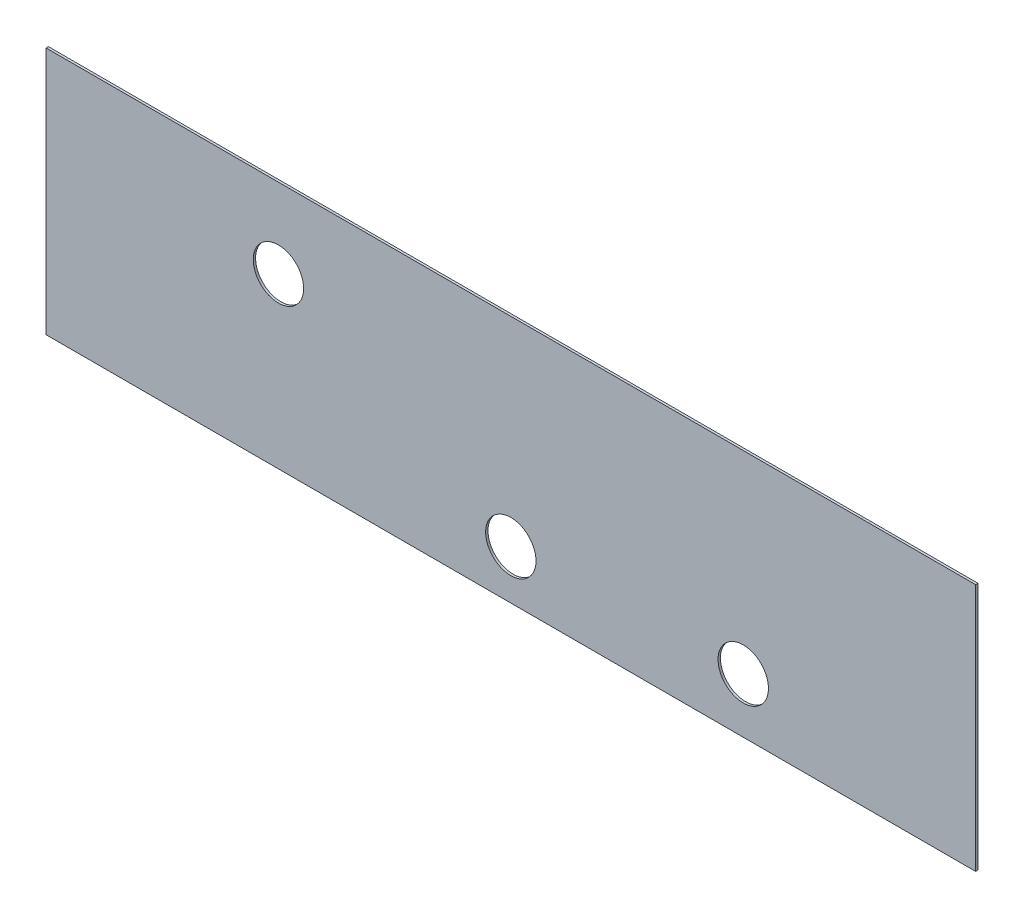
ISO-10303-21;
HEADER;
FILE_DESCRIPTION(('STEP AP214'),'2;1');
FILE_NAME('part.step','',(''),(''),'','','');
FILE_SCHEMA(('AUTOMOTIVE_DESIGN { 1 0 10303 214 1 1 1 1 }'));
ENDSEC;
DATA;
#1=APPLICATION_CONTEXT('core data for automotive mechanical design processes');
#2=APPLICATION_PROTOCOL_DEFINITION('international standard','automotive_design',2000,#1);
#3=PRODUCT_CONTEXT('',#1,'mechanical');
#4=PRODUCT('Part','Part','',(#3));
#5=PRODUCT_RELATED_PRODUCT_CATEGORY('part','',(#4));
#6=PRODUCT_DEFINITION_FORMATION('','',#4);
#7=PRODUCT_DEFINITION_CONTEXT('part definition',#1,'design');
#8=PRODUCT_DEFINITION('design','',#6,#7);
#9=PRODUCT_DEFINITION_SHAPE('','',#8);
#10=(LENGTH_UNIT() NAMED_UNIT(*) SI_UNIT(.MILLI.,.METRE.));
#11=(NAMED_UNIT(*) PLANE_ANGLE_UNIT() SI_UNIT($,.RADIAN.));
#12=(NAMED_UNIT(*) SI_UNIT($,.STERADIAN.) SOLID_ANGLE_UNIT());
#13=UNCERTAINTY_MEASURE_WITH_UNIT(LENGTH_MEASURE(1.E-05),#10,'distance_accuracy_value','');
#14=(GEOMETRIC_REPRESENTATION_CONTEXT(3) GLOBAL_UNCERTAINTY_ASSIGNED_CONTEXT((#13)) GLOBAL_UNIT_ASSIGNED_CONTEXT((#10,
#11,#12)) REPRESENTATION_CONTEXT('',''));
#15=CARTESIAN_POINT('',(0.,0.,0.));
#16=DIRECTION('',(0.,0.,1.));
#17=DIRECTION('',(1.,0.,0.));
#18=AXIS2_PLACEMENT_3D('',#15,#16,#17);
#19=CARTESIAN_POINT('',(0.,0.,1.));
#20=DIRECTION('',(0.,0.,-1.));
#21=DIRECTION('',(-1.,0.,0.));
#22=AXIS2_PLACEMENT_3D('',#19,#20,#21);
#23=PLANE('',#22);
#24=CARTESIAN_POINT('',(98.73,71.7,1.));
#25=DIRECTION('',(0.,0.,1.));
#26=DIRECTION('',(1.,0.,0.));
#27=AXIS2_PLACEMENT_3D('',#24,#25,#26);
#28=CIRCLE('',#27,10.7);
#29=CARTESIAN_POINT('',(109.43,71.7,1.));
#30=VERTEX_POINT('',#29);
#31=EDGE_CURVE('E115',#30,#30,#28,.T.);
#32=ORIENTED_EDGE('',*,*,#31,.F.);
#33=EDGE_LOOP('',(#32));
#34=FACE_BOUND('',#33,.T.);
#35=DIRECTION('',(1.,0.,0.));
#36=VECTOR('',#35,1.);
#37=CARTESIAN_POINT('',(394.92,0.,1.));
#38=LINE('',#37,#36);
#39=CARTESIAN_POINT('',(0.,0.,1.));
#40=VERTEX_POINT('',#39);
#41=CARTESIAN_POINT('',(394.92,0.,1.));
#42=VERTEX_POINT('',#41);
#43=EDGE_CURVE('E85',#40,#42,#38,.T.);
#44=ORIENTED_EDGE('',*,*,#43,.T.);
#45=DIRECTION('',(0.,1.,0.));
#46=VECTOR('',#45,1.);
#47=CARTESIAN_POINT('',(394.92,105.5,1.));
#48=LINE('',#47,#46);
#49=CARTESIAN_POINT('',(394.92,105.5,1.));
#50=VERTEX_POINT('',#49);
#51=EDGE_CURVE('E80',#42,#50,#48,.T.);
#52=ORIENTED_EDGE('',*,*,#51,.T.);
#53=DIRECTION('',(-1.,0.,0.));
#54=VECTOR('',#53,1.);
#55=CARTESIAN_POINT('',(0.,105.5,1.));
#56=LINE('',#55,#54);
#57=CARTESIAN_POINT('',(0.,105.5,1.));
#58=VERTEX_POINT('',#57);
#59=EDGE_CURVE('E83',#50,#58,#56,.T.);
#60=ORIENTED_EDGE('',*,*,#59,.T.);
#61=DIRECTION('',(0.,-1.,0.));
#62=VECTOR('',#61,1.);
#63=CARTESIAN_POINT('',(0.,0.,1.));
#64=LINE('',#63,#62);
#65=EDGE_CURVE('E50',#58,#40,#64,.T.);
#66=ORIENTED_EDGE('',*,*,#65,.T.);
#67=EDGE_LOOP('',(#44,#52,#60,#66));
#68=FACE_BOUND('',#67,.T.);
#69=CARTESIAN_POINT('',(197.46,20.8,1.));
#70=DIRECTION('',(0.,0.,1.));
#71=DIRECTION('',(1.,0.,0.));
#72=AXIS2_PLACEMENT_3D('',#69,#70,#71);
#73=CIRCLE('',#72,10.7);
#74=CARTESIAN_POINT('',(208.16,20.8,1.));
#75=VERTEX_POINT('',#74);
#76=EDGE_CURVE('E100',#75,#75,#73,.T.);
#77=ORIENTED_EDGE('',*,*,#76,.F.);
#78=EDGE_LOOP('',(#77));
#79=FACE_BOUND('',#78,.T.);
#80=CARTESIAN_POINT('',(296.19,23.3,1.));
#81=DIRECTION('',(0.,0.,1.));
#82=DIRECTION('',(1.,0.,0.));
#83=AXIS2_PLACEMENT_3D('',#80,#81,#82);
#84=CIRCLE('',#83,10.7);
#85=CARTESIAN_POINT('',(306.89,23.3,1.));
#86=VERTEX_POINT('',#85);
#87=EDGE_CURVE('E121',#86,#86,#84,.T.);
#88=ORIENTED_EDGE('',*,*,#87,.F.);
#89=EDGE_LOOP('',(#88));
#90=FACE_BOUND('',#89,.T.);
#91=ADVANCED_FACE('F33',(#34,#68,#79,#90),#23,.F.);
#92=CARTESIAN_POINT('',(0.,0.,0.));
#93=DIRECTION('',(0.,0.,-1.));
#94=DIRECTION('',(-1.,0.,0.));
#95=AXIS2_PLACEMENT_3D('',#92,#93,#94);
#96=PLANE('',#95);
#97=CARTESIAN_POINT('',(98.73,71.7,0.));
#98=DIRECTION('',(0.,0.,1.));
#99=DIRECTION('',(1.,0.,0.));
#100=AXIS2_PLACEMENT_3D('',#97,#98,#99);
#101=CIRCLE('',#100,10.7);
#102=CARTESIAN_POINT('',(109.43,71.7,0.));
#103=VERTEX_POINT('',#102);
#104=EDGE_CURVE('E118',#103,#103,#101,.T.);
#105=ORIENTED_EDGE('',*,*,#104,.T.);
#106=EDGE_LOOP('',(#105));
#107=FACE_BOUND('',#106,.T.);
#108=DIRECTION('',(1.,0.,0.));
#109=VECTOR('',#108,1.);
#110=CARTESIAN_POINT('',(394.92,0.,0.));
#111=LINE('',#110,#109);
#112=CARTESIAN_POINT('',(0.,0.,0.));
#113=VERTEX_POINT('',#112);
#114=CARTESIAN_POINT('',(394.92,0.,0.));
#115=VERTEX_POINT('',#114);
#116=EDGE_CURVE('E97',#113,#115,#111,.T.);
#117=ORIENTED_EDGE('',*,*,#116,.F.);
#118=DIRECTION('',(0.,-1.,0.));
#119=VECTOR('',#118,1.);
#120=CARTESIAN_POINT('',(0.,0.,0.));
#121=LINE('',#120,#119);
#122=CARTESIAN_POINT('',(0.,105.5,0.));
#123=VERTEX_POINT('',#122);
#124=EDGE_CURVE('E73',#123,#113,#121,.T.);
#125=ORIENTED_EDGE('',*,*,#124,.F.);
#126=DIRECTION('',(-1.,0.,0.));
#127=VECTOR('',#126,1.);
#128=CARTESIAN_POINT('',(0.,105.5,0.));
#129=LINE('',#128,#127);
#130=CARTESIAN_POINT('',(394.92,105.5,0.));
#131=VERTEX_POINT('',#130);
#132=EDGE_CURVE('E67',#131,#123,#129,.T.);
#133=ORIENTED_EDGE('',*,*,#132,.F.);
#134=DIRECTION('',(0.,1.,0.));
#135=VECTOR('',#134,1.);
#136=CARTESIAN_POINT('',(394.92,105.5,0.));
#137=LINE('',#136,#135);
#138=EDGE_CURVE('E89',#115,#131,#137,.T.);
#139=ORIENTED_EDGE('',*,*,#138,.F.);
#140=EDGE_LOOP('',(#117,#125,#133,#139));
#141=FACE_BOUND('',#140,.T.);
#142=CARTESIAN_POINT('',(197.46,20.8,0.));
#143=DIRECTION('',(0.,0.,1.));
#144=DIRECTION('',(1.,0.,0.));
#145=AXIS2_PLACEMENT_3D('',#142,#143,#144);
#146=CIRCLE('',#145,10.7);
#147=CARTESIAN_POINT('',(208.16,20.8,0.));
#148=VERTEX_POINT('',#147);
#149=EDGE_CURVE('E112',#148,#148,#146,.T.);
#150=ORIENTED_EDGE('',*,*,#149,.T.);
#151=EDGE_LOOP('',(#150));
#152=FACE_BOUND('',#151,.T.);
#153=CARTESIAN_POINT('',(296.19,23.3,0.));
#154=DIRECTION('',(0.,0.,1.));
#155=DIRECTION('',(1.,0.,0.));
#156=AXIS2_PLACEMENT_3D('',#153,#154,#155);
#157=CIRCLE('',#156,10.7);
#158=CARTESIAN_POINT('',(306.89,23.3,0.));
#159=VERTEX_POINT('',#158);
#160=EDGE_CURVE('E124',#159,#159,#157,.T.);
#161=ORIENTED_EDGE('',*,*,#160,.T.);
#162=EDGE_LOOP('',(#161));
#163=FACE_BOUND('',#162,.T.);
#164=ADVANCED_FACE('F108',(#107,#141,#152,#163),#96,.T.);
#165=CARTESIAN_POINT('',(394.92,0.,1.));
#166=DIRECTION('',(0.,1.,0.));
#167=DIRECTION('',(-1.,0.,0.));
#168=AXIS2_PLACEMENT_3D('',#165,#166,#167);
#169=PLANE('',#168);
#170=ORIENTED_EDGE('',*,*,#116,.T.);
#171=DIRECTION('',(0.,0.,-1.));
#172=VECTOR('',#171,1.);
#173=CARTESIAN_POINT('',(394.92,0.,1.));
#174=LINE('',#173,#172);
#175=EDGE_CURVE('E11',#42,#115,#174,.T.);
#176=ORIENTED_EDGE('',*,*,#175,.F.);
#177=ORIENTED_EDGE('',*,*,#43,.F.);
#178=DIRECTION('',(0.,0.,-1.));
#179=VECTOR('',#178,1.);
#180=CARTESIAN_POINT('',(0.,0.,1.));
#181=LINE('',#180,#179);
#182=EDGE_CURVE('E93',#40,#113,#181,.T.);
#183=ORIENTED_EDGE('',*,*,#182,.T.);
#184=EDGE_LOOP('',(#170,#176,#177,#183));
#185=FACE_BOUND('',#184,.T.);
#186=ADVANCED_FACE('F35',(#185),#169,.F.);
#187=CARTESIAN_POINT('',(394.92,105.5,1.));
#188=DIRECTION('',(-1.,0.,0.));
#189=DIRECTION('',(0.,0.,1.));
#190=AXIS2_PLACEMENT_3D('',#187,#188,#189);
#191=PLANE('',#190);
#192=ORIENTED_EDGE('',*,*,#138,.T.);
#193=DIRECTION('',(0.,0.,-1.));
#194=VECTOR('',#193,1.);
#195=CARTESIAN_POINT('',(394.92,105.5,1.));
#196=LINE('',#195,#194);
#197=EDGE_CURVE('E42',#50,#131,#196,.T.);
#198=ORIENTED_EDGE('',*,*,#197,.F.);
#199=ORIENTED_EDGE('',*,*,#51,.F.);
#200=ORIENTED_EDGE('',*,*,#175,.T.);
#201=EDGE_LOOP('',(#192,#198,#199,#200));
#202=FACE_BOUND('',#201,.T.);
#203=ADVANCED_FACE('F88',(#202),#191,.F.);
#204=CARTESIAN_POINT('',(0.,105.5,1.));
#205=DIRECTION('',(0.,-1.,0.));
#206=DIRECTION('',(0.,0.,-1.));
#207=AXIS2_PLACEMENT_3D('',#204,#205,#206);
#208=PLANE('',#207);
#209=ORIENTED_EDGE('',*,*,#132,.T.);
#210=DIRECTION('',(0.,0.,-1.));
#211=VECTOR('',#210,1.);
#212=CARTESIAN_POINT('',(0.,105.5,1.));
#213=LINE('',#212,#211);
#214=EDGE_CURVE('E90',#58,#123,#213,.T.);
#215=ORIENTED_EDGE('',*,*,#214,.F.);
#216=ORIENTED_EDGE('',*,*,#59,.F.);
#217=ORIENTED_EDGE('',*,*,#197,.T.);
#218=EDGE_LOOP('',(#209,#215,#216,#217));
#219=FACE_BOUND('',#218,.T.);
#220=ADVANCED_FACE('F91',(#219),#208,.F.);
#221=CARTESIAN_POINT('',(0.,0.,1.));
#222=DIRECTION('',(1.,0.,0.));
#223=DIRECTION('',(0.,0.,-1.));
#224=AXIS2_PLACEMENT_3D('',#221,#222,#223);
#225=PLANE('',#224);
#226=ORIENTED_EDGE('',*,*,#124,.T.);
#227=ORIENTED_EDGE('',*,*,#182,.F.);
#228=ORIENTED_EDGE('',*,*,#65,.F.);
#229=ORIENTED_EDGE('',*,*,#214,.T.);
#230=EDGE_LOOP('',(#226,#227,#228,#229));
#231=FACE_BOUND('',#230,.T.);
#232=ADVANCED_FACE('F105',(#231),#225,.F.);
#233=CARTESIAN_POINT('',(197.46,20.8,1.));
#234=DIRECTION('',(0.,0.,-1.));
#235=DIRECTION('',(-1.,0.,0.));
#236=AXIS2_PLACEMENT_3D('',#233,#234,#235);
#237=CYLINDRICAL_SURFACE('',#236,10.7);
#238=ORIENTED_EDGE('',*,*,#76,.T.);
#239=EDGE_LOOP('',(#238));
#240=FACE_BOUND('',#239,.T.);
#241=ORIENTED_EDGE('',*,*,#149,.F.);
#242=EDGE_LOOP('',(#241));
#243=FACE_BOUND('',#242,.T.);
#244=ADVANCED_FACE('F143',(#240,#243),#237,.F.);
#245=CARTESIAN_POINT('',(98.73,71.7,1.));
#246=DIRECTION('',(0.,0.,-1.));
#247=DIRECTION('',(-1.,0.,0.));
#248=AXIS2_PLACEMENT_3D('',#245,#246,#247);
#249=CYLINDRICAL_SURFACE('',#248,10.7);
#250=ORIENTED_EDGE('',*,*,#31,.T.);
#251=EDGE_LOOP('',(#250));
#252=FACE_BOUND('',#251,.T.);
#253=ORIENTED_EDGE('',*,*,#104,.F.);
#254=EDGE_LOOP('',(#253));
#255=FACE_BOUND('',#254,.T.);
#256=ADVANCED_FACE('F189',(#252,#255),#249,.F.);
#257=CARTESIAN_POINT('',(296.19,23.3,1.));
#258=DIRECTION('',(0.,0.,-1.));
#259=DIRECTION('',(-1.,0.,0.));
#260=AXIS2_PLACEMENT_3D('',#257,#258,#259);
#261=CYLINDRICAL_SURFACE('',#260,10.7);
#262=ORIENTED_EDGE('',*,*,#87,.T.);
#263=EDGE_LOOP('',(#262));
#264=FACE_BOUND('',#263,.T.);
#265=ORIENTED_EDGE('',*,*,#160,.F.);
#266=EDGE_LOOP('',(#265));
#267=FACE_BOUND('',#266,.T.);
#268=ADVANCED_FACE('F130',(#264,#267),#261,.F.);
#269=CLOSED_SHELL('',(#91,#164,#186,#203,#220,#232,#244,#256,#268));
#270=MANIFOLD_SOLID_BREP('B2',#269);
#271=ADVANCED_BREP_SHAPE_REPRESENTATION('',(#18,#270),#14);
#272=SHAPE_DEFINITION_REPRESENTATION(#9,#271);
ENDSEC;
END-ISO-10303-21;
